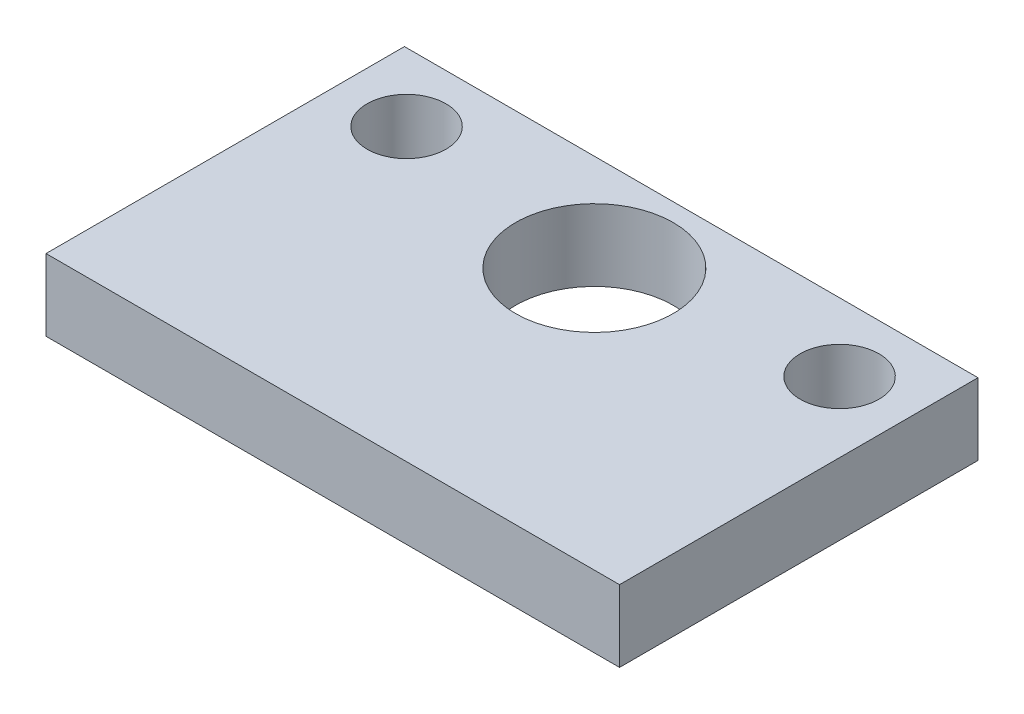
ISO-10303-21;
HEADER;
FILE_DESCRIPTION(('STEP AP214'),'2;1');
FILE_NAME('part.step','',(''),(''),'','','');
FILE_SCHEMA(('AUTOMOTIVE_DESIGN { 1 0 10303 214 1 1 1 1 }'));
ENDSEC;
DATA;
#1=APPLICATION_CONTEXT('core data for automotive mechanical design processes');
#2=APPLICATION_PROTOCOL_DEFINITION('international standard','automotive_design',2000,#1);
#3=PRODUCT_CONTEXT('',#1,'mechanical');
#4=PRODUCT('Part','Part','',(#3));
#5=PRODUCT_RELATED_PRODUCT_CATEGORY('part','',(#4));
#6=PRODUCT_DEFINITION_FORMATION('','',#4);
#7=PRODUCT_DEFINITION_CONTEXT('part definition',#1,'design');
#8=PRODUCT_DEFINITION('design','',#6,#7);
#9=PRODUCT_DEFINITION_SHAPE('','',#8);
#10=(LENGTH_UNIT() NAMED_UNIT(*) SI_UNIT(.MILLI.,.METRE.));
#11=(NAMED_UNIT(*) PLANE_ANGLE_UNIT() SI_UNIT($,.RADIAN.));
#12=(NAMED_UNIT(*) SI_UNIT($,.STERADIAN.) SOLID_ANGLE_UNIT());
#13=UNCERTAINTY_MEASURE_WITH_UNIT(LENGTH_MEASURE(1.E-05),#10,'distance_accuracy_value','');
#14=(GEOMETRIC_REPRESENTATION_CONTEXT(3) GLOBAL_UNCERTAINTY_ASSIGNED_CONTEXT((#13)) GLOBAL_UNIT_ASSIGNED_CONTEXT((#10,
#11,#12)) REPRESENTATION_CONTEXT('',''));
#15=CARTESIAN_POINT('',(0.,0.,0.));
#16=DIRECTION('',(0.,0.,1.));
#17=DIRECTION('',(1.,0.,0.));
#18=AXIS2_PLACEMENT_3D('',#15,#16,#17);
#19=CARTESIAN_POINT('',(45.,10.,25.));
#20=DIRECTION('',(-1.,0.,0.));
#21=DIRECTION('',(0.,0.,1.));
#22=AXIS2_PLACEMENT_3D('',#19,#20,#21);
#23=PLANE('',#22);
#24=DIRECTION('',(0.,0.,-1.));
#25=VECTOR('',#24,1.);
#26=CARTESIAN_POINT('',(45.,0.,25.));
#27=LINE('',#26,#25);
#28=CARTESIAN_POINT('',(45.,0.,25.));
#29=VERTEX_POINT('',#28);
#30=CARTESIAN_POINT('',(45.,0.,-25.));
#31=VERTEX_POINT('',#30);
#32=EDGE_CURVE('E96',#29,#31,#27,.T.);
#33=ORIENTED_EDGE('',*,*,#32,.T.);
#34=DIRECTION('',(0.,-1.,0.));
#35=VECTOR('',#34,1.);
#36=CARTESIAN_POINT('',(45.,10.,-25.));
#37=LINE('',#36,#35);
#38=CARTESIAN_POINT('',(45.,10.,-25.));
#39=VERTEX_POINT('',#38);
#40=EDGE_CURVE('E11',#39,#31,#37,.T.);
#41=ORIENTED_EDGE('',*,*,#40,.F.);
#42=DIRECTION('',(0.,0.,-1.));
#43=VECTOR('',#42,1.);
#44=CARTESIAN_POINT('',(45.,10.,25.));
#45=LINE('',#44,#43);
#46=CARTESIAN_POINT('',(45.,10.,25.));
#47=VERTEX_POINT('',#46);
#48=EDGE_CURVE('E84',#47,#39,#45,.T.);
#49=ORIENTED_EDGE('',*,*,#48,.F.);
#50=DIRECTION('',(0.,-1.,0.));
#51=VECTOR('',#50,1.);
#52=CARTESIAN_POINT('',(45.,10.,25.));
#53=LINE('',#52,#51);
#54=EDGE_CURVE('E92',#47,#29,#53,.T.);
#55=ORIENTED_EDGE('',*,*,#54,.T.);
#56=EDGE_LOOP('',(#33,#41,#49,#55));
#57=FACE_BOUND('',#56,.T.);
#58=ADVANCED_FACE('F33',(#57),#23,.F.);
#59=CARTESIAN_POINT('',(-35.,10.,-25.));
#60=DIRECTION('',(0.,0.,1.));
#61=DIRECTION('',(1.,0.,0.));
#62=AXIS2_PLACEMENT_3D('',#59,#60,#61);
#63=PLANE('',#62);
#64=DIRECTION('',(-1.,0.,0.));
#65=VECTOR('',#64,1.);
#66=CARTESIAN_POINT('',(-35.,0.,-25.));
#67=LINE('',#66,#65);
#68=CARTESIAN_POINT('',(-35.,0.,-25.));
#69=VERTEX_POINT('',#68);
#70=EDGE_CURVE('E88',#31,#69,#67,.T.);
#71=ORIENTED_EDGE('',*,*,#70,.T.);
#72=DIRECTION('',(0.,-1.,0.));
#73=VECTOR('',#72,1.);
#74=CARTESIAN_POINT('',(-35.,10.,-25.));
#75=LINE('',#74,#73);
#76=CARTESIAN_POINT('',(-35.,10.,-25.));
#77=VERTEX_POINT('',#76);
#78=EDGE_CURVE('E41',#77,#69,#75,.T.);
#79=ORIENTED_EDGE('',*,*,#78,.F.);
#80=DIRECTION('',(-1.,0.,0.));
#81=VECTOR('',#80,1.);
#82=CARTESIAN_POINT('',(-35.,10.,-25.));
#83=LINE('',#82,#81);
#84=EDGE_CURVE('E79',#39,#77,#83,.T.);
#85=ORIENTED_EDGE('',*,*,#84,.F.);
#86=ORIENTED_EDGE('',*,*,#40,.T.);
#87=EDGE_LOOP('',(#71,#79,#85,#86));
#88=FACE_BOUND('',#87,.T.);
#89=ADVANCED_FACE('F87',(#88),#63,.F.);
#90=CARTESIAN_POINT('',(-35.,10.,25.));
#91=DIRECTION('',(1.,0.,0.));
#92=DIRECTION('',(0.,0.,-1.));
#93=AXIS2_PLACEMENT_3D('',#90,#91,#92);
#94=PLANE('',#93);
#95=DIRECTION('',(0.,0.,1.));
#96=VECTOR('',#95,1.);
#97=CARTESIAN_POINT('',(-35.,0.,25.));
#98=LINE('',#97,#96);
#99=CARTESIAN_POINT('',(-35.,0.,25.));
#100=VERTEX_POINT('',#99);
#101=EDGE_CURVE('E66',#69,#100,#98,.T.);
#102=ORIENTED_EDGE('',*,*,#101,.T.);
#103=DIRECTION('',(0.,-1.,0.));
#104=VECTOR('',#103,1.);
#105=CARTESIAN_POINT('',(-35.,10.,25.));
#106=LINE('',#105,#104);
#107=CARTESIAN_POINT('',(-35.,10.,25.));
#108=VERTEX_POINT('',#107);
#109=EDGE_CURVE('E89',#108,#100,#106,.T.);
#110=ORIENTED_EDGE('',*,*,#109,.F.);
#111=DIRECTION('',(0.,0.,1.));
#112=VECTOR('',#111,1.);
#113=CARTESIAN_POINT('',(-35.,10.,25.));
#114=LINE('',#113,#112);
#115=EDGE_CURVE('E82',#77,#108,#114,.T.);
#116=ORIENTED_EDGE('',*,*,#115,.F.);
#117=ORIENTED_EDGE('',*,*,#78,.T.);
#118=EDGE_LOOP('',(#102,#110,#116,#117));
#119=FACE_BOUND('',#118,.T.);
#120=ADVANCED_FACE('F90',(#119),#94,.F.);
#121=CARTESIAN_POINT('',(-35.,10.,25.));
#122=DIRECTION('',(0.,0.,-1.));
#123=DIRECTION('',(-1.,0.,0.));
#124=AXIS2_PLACEMENT_3D('',#121,#122,#123);
#125=PLANE('',#124);
#126=DIRECTION('',(1.,0.,0.));
#127=VECTOR('',#126,1.);
#128=CARTESIAN_POINT('',(-35.,0.,25.));
#129=LINE('',#128,#127);
#130=EDGE_CURVE('E72',#100,#29,#129,.T.);
#131=ORIENTED_EDGE('',*,*,#130,.T.);
#132=ORIENTED_EDGE('',*,*,#54,.F.);
#133=DIRECTION('',(1.,0.,0.));
#134=VECTOR('',#133,1.);
#135=CARTESIAN_POINT('',(-35.,10.,25.));
#136=LINE('',#135,#134);
#137=EDGE_CURVE('E49',#108,#47,#136,.T.);
#138=ORIENTED_EDGE('',*,*,#137,.F.);
#139=ORIENTED_EDGE('',*,*,#109,.T.);
#140=EDGE_LOOP('',(#131,#132,#138,#139));
#141=FACE_BOUND('',#140,.T.);
#142=ADVANCED_FACE('F104',(#141),#125,.F.);
#143=CARTESIAN_POINT('',(0.,10.,0.));
#144=DIRECTION('',(0.,-1.,0.));
#145=DIRECTION('',(0.,0.,-1.));
#146=AXIS2_PLACEMENT_3D('',#143,#144,#145);
#147=PLANE('',#146);
#148=CARTESIAN_POINT('',(4.99999999999999,10.,-11.49130346));
#149=DIRECTION('',(0.,1.,0.));
#150=DIRECTION('',(0.,0.,1.));
#151=AXIS2_PLACEMENT_3D('',#148,#149,#150);
#152=CIRCLE('',#151,11.);
#153=CARTESIAN_POINT('',(4.99999999999999,10.,-0.491303459999998));
#154=VERTEX_POINT('',#153);
#155=EDGE_CURVE('E122',#154,#154,#152,.T.);
#156=ORIENTED_EDGE('',*,*,#155,.F.);
#157=EDGE_LOOP('',(#156));
#158=FACE_BOUND('',#157,.T.);
#159=CARTESIAN_POINT('',(35.2,10.,-15.49130346));
#160=DIRECTION('',(0.,1.,0.));
#161=DIRECTION('',(0.,0.,-1.));
#162=AXIS2_PLACEMENT_3D('',#159,#160,#161);
#163=CIRCLE('',#162,5.49999999999999);
#164=CARTESIAN_POINT('',(35.2,10.,-20.99130346));
#165=VERTEX_POINT('',#164);
#166=EDGE_CURVE('E116',#165,#165,#163,.T.);
#167=ORIENTED_EDGE('',*,*,#166,.F.);
#168=EDGE_LOOP('',(#167));
#169=FACE_BOUND('',#168,.T.);
#170=CARTESIAN_POINT('',(-25.20025306,10.,-15.49130346));
#171=DIRECTION('',(0.,1.,0.));
#172=DIRECTION('',(0.,0.,1.));
#173=AXIS2_PLACEMENT_3D('',#170,#171,#172);
#174=CIRCLE('',#173,5.5);
#175=CARTESIAN_POINT('',(-25.20025306,10.,-9.99130346));
#176=VERTEX_POINT('',#175);
#177=EDGE_CURVE('E110',#176,#176,#174,.T.);
#178=ORIENTED_EDGE('',*,*,#177,.F.);
#179=EDGE_LOOP('',(#178));
#180=FACE_BOUND('',#179,.T.);
#181=ORIENTED_EDGE('',*,*,#48,.T.);
#182=ORIENTED_EDGE('',*,*,#84,.T.);
#183=ORIENTED_EDGE('',*,*,#115,.T.);
#184=ORIENTED_EDGE('',*,*,#137,.T.);
#185=EDGE_LOOP('',(#181,#182,#183,#184));
#186=FACE_BOUND('',#185,.T.);
#187=ADVANCED_FACE('F80',(#158,#169,#180,#186),#147,.F.);
#188=CARTESIAN_POINT('',(0.,0.,0.));
#189=DIRECTION('',(0.,-1.,0.));
#190=DIRECTION('',(0.,0.,-1.));
#191=AXIS2_PLACEMENT_3D('',#188,#189,#190);
#192=PLANE('',#191);
#193=CARTESIAN_POINT('',(4.99999999999999,0.,13.));
#194=DIRECTION('',(0.,-1.,0.));
#195=DIRECTION('',(0.,0.,-1.));
#196=AXIS2_PLACEMENT_3D('',#193,#194,#195);
#197=CIRCLE('',#196,10.);
#198=CARTESIAN_POINT('',(4.99999999999999,0.,3.00000000000001));
#199=VERTEX_POINT('',#198);
#200=EDGE_CURVE('E128',#199,#199,#197,.T.);
#201=ORIENTED_EDGE('',*,*,#200,.F.);
#202=EDGE_LOOP('',(#201));
#203=FACE_BOUND('',#202,.T.);
#204=CARTESIAN_POINT('',(4.99999999999999,0.,-11.49130346));
#205=DIRECTION('',(0.,1.,0.));
#206=DIRECTION('',(0.,0.,1.));
#207=AXIS2_PLACEMENT_3D('',#204,#205,#206);
#208=CIRCLE('',#207,11.);
#209=CARTESIAN_POINT('',(4.99999999999999,0.,-0.491303459999998));
#210=VERTEX_POINT('',#209);
#211=EDGE_CURVE('E119',#210,#210,#208,.T.);
#212=ORIENTED_EDGE('',*,*,#211,.T.);
#213=EDGE_LOOP('',(#212));
#214=FACE_BOUND('',#213,.T.);
#215=CARTESIAN_POINT('',(35.2,0.,-15.49130346));
#216=DIRECTION('',(0.,1.,0.));
#217=DIRECTION('',(0.,0.,-1.));
#218=AXIS2_PLACEMENT_3D('',#215,#216,#217);
#219=CIRCLE('',#218,5.49999999999999);
#220=CARTESIAN_POINT('',(35.2,0.,-20.99130346));
#221=VERTEX_POINT('',#220);
#222=EDGE_CURVE('E113',#221,#221,#219,.T.);
#223=ORIENTED_EDGE('',*,*,#222,.T.);
#224=EDGE_LOOP('',(#223));
#225=FACE_BOUND('',#224,.T.);
#226=CARTESIAN_POINT('',(-25.20025306,0.,-15.49130346));
#227=DIRECTION('',(0.,1.,0.));
#228=DIRECTION('',(0.,0.,1.));
#229=AXIS2_PLACEMENT_3D('',#226,#227,#228);
#230=CIRCLE('',#229,5.5);
#231=CARTESIAN_POINT('',(-25.20025306,0.,-9.99130346));
#232=VERTEX_POINT('',#231);
#233=EDGE_CURVE('E99',#232,#232,#230,.T.);
#234=ORIENTED_EDGE('',*,*,#233,.T.);
#235=EDGE_LOOP('',(#234));
#236=FACE_BOUND('',#235,.T.);
#237=ORIENTED_EDGE('',*,*,#32,.F.);
#238=ORIENTED_EDGE('',*,*,#130,.F.);
#239=ORIENTED_EDGE('',*,*,#101,.F.);
#240=ORIENTED_EDGE('',*,*,#70,.F.);
#241=EDGE_LOOP('',(#237,#238,#239,#240));
#242=FACE_BOUND('',#241,.T.);
#243=ADVANCED_FACE('F107',(#203,#214,#225,#236,#242),#192,.T.);
#244=CARTESIAN_POINT('',(-25.20025306,0.,-15.49130346));
#245=DIRECTION('',(0.,1.,0.));
#246=DIRECTION('',(0.,0.,1.));
#247=AXIS2_PLACEMENT_3D('',#244,#245,#246);
#248=CYLINDRICAL_SURFACE('',#247,5.5);
#249=ORIENTED_EDGE('',*,*,#233,.F.);
#250=EDGE_LOOP('',(#249));
#251=FACE_BOUND('',#250,.T.);
#252=ORIENTED_EDGE('',*,*,#177,.T.);
#253=EDGE_LOOP('',(#252));
#254=FACE_BOUND('',#253,.T.);
#255=ADVANCED_FACE('F145',(#251,#254),#248,.F.);
#256=CARTESIAN_POINT('',(35.2,0.,-15.49130346));
#257=DIRECTION('',(0.,1.,0.));
#258=DIRECTION('',(0.,0.,1.));
#259=AXIS2_PLACEMENT_3D('',#256,#257,#258);
#260=CYLINDRICAL_SURFACE('',#259,5.49999999999999);
#261=ORIENTED_EDGE('',*,*,#222,.F.);
#262=EDGE_LOOP('',(#261));
#263=FACE_BOUND('',#262,.T.);
#264=ORIENTED_EDGE('',*,*,#166,.T.);
#265=EDGE_LOOP('',(#264));
#266=FACE_BOUND('',#265,.T.);
#267=ADVANCED_FACE('F155',(#263,#266),#260,.F.);
#268=CARTESIAN_POINT('',(4.99999999999999,0.,-11.49130346));
#269=DIRECTION('',(0.,1.,0.));
#270=DIRECTION('',(0.,0.,1.));
#271=AXIS2_PLACEMENT_3D('',#268,#269,#270);
#272=CYLINDRICAL_SURFACE('',#271,11.);
#273=ORIENTED_EDGE('',*,*,#211,.F.);
#274=EDGE_LOOP('',(#273));
#275=FACE_BOUND('',#274,.T.);
#276=ORIENTED_EDGE('',*,*,#155,.T.);
#277=EDGE_LOOP('',(#276));
#278=FACE_BOUND('',#277,.T.);
#279=ADVANCED_FACE('F139',(#275,#278),#272,.F.);
#280=CARTESIAN_POINT('',(4.99999999999999,5.,13.));
#281=DIRECTION('',(0.,-1.,0.));
#282=DIRECTION('',(0.,0.,-1.));
#283=AXIS2_PLACEMENT_3D('',#280,#281,#282);
#284=CYLINDRICAL_SURFACE('',#283,10.);
#285=CARTESIAN_POINT('',(4.99999999999999,5.,13.));
#286=DIRECTION('',(0.,-1.,0.));
#287=DIRECTION('',(0.,0.,-1.));
#288=AXIS2_PLACEMENT_3D('',#285,#286,#287);
#289=CIRCLE('',#288,10.);
#290=CARTESIAN_POINT('',(4.99999999999999,5.,3.00000000000001));
#291=VERTEX_POINT('',#290);
#292=EDGE_CURVE('E125',#291,#291,#289,.T.);
#293=ORIENTED_EDGE('',*,*,#292,.F.);
#294=EDGE_LOOP('',(#293));
#295=FACE_BOUND('',#294,.T.);
#296=ORIENTED_EDGE('',*,*,#200,.T.);
#297=EDGE_LOOP('',(#296));
#298=FACE_BOUND('',#297,.T.);
#299=ADVANCED_FACE('F136',(#295,#298),#284,.F.);
#300=CARTESIAN_POINT('',(4.99999999999999,5.,13.));
#301=DIRECTION('',(0.,-1.,0.));
#302=DIRECTION('',(0.,0.,-1.));
#303=AXIS2_PLACEMENT_3D('',#300,#301,#302);
#304=PLANE('',#303);
#305=ORIENTED_EDGE('',*,*,#292,.T.);
#306=EDGE_LOOP('',(#305));
#307=FACE_BOUND('',#306,.T.);
#308=ADVANCED_FACE('F134',(#307),#304,.T.);
#309=CLOSED_SHELL('',(#58,#89,#120,#142,#187,#243,#255,#267,#279,#299,#308));
#310=MANIFOLD_SOLID_BREP('B2',#309);
#311=ADVANCED_BREP_SHAPE_REPRESENTATION('',(#18,#310),#14);
#312=SHAPE_DEFINITION_REPRESENTATION(#9,#311);
ENDSEC;
END-ISO-10303-21;
